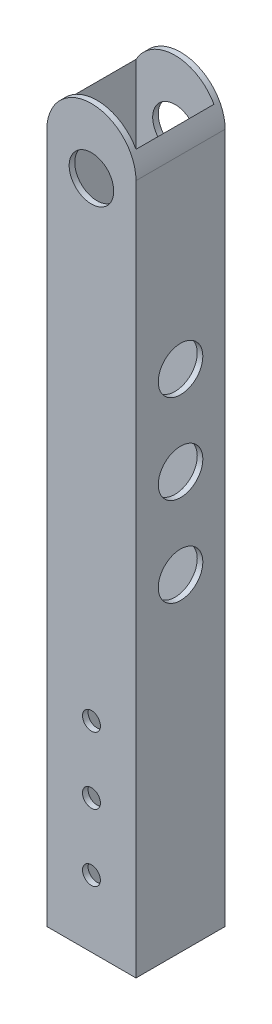
ISO-10303-21;
HEADER;
FILE_DESCRIPTION(('STEP AP214'),'2;1');
FILE_NAME('part.step','',(''),(''),'','','');
FILE_SCHEMA(('AUTOMOTIVE_DESIGN { 1 0 10303 214 1 1 1 1 }'));
ENDSEC;
DATA;
#1=APPLICATION_CONTEXT('core data for automotive mechanical design processes');
#2=APPLICATION_PROTOCOL_DEFINITION('international standard','automotive_design',2000,#1);
#3=PRODUCT_CONTEXT('',#1,'mechanical');
#4=PRODUCT('Part','Part','',(#3));
#5=PRODUCT_RELATED_PRODUCT_CATEGORY('part','',(#4));
#6=PRODUCT_DEFINITION_FORMATION('','',#4);
#7=PRODUCT_DEFINITION_CONTEXT('part definition',#1,'design');
#8=PRODUCT_DEFINITION('design','',#6,#7);
#9=PRODUCT_DEFINITION_SHAPE('','',#8);
#10=(LENGTH_UNIT() NAMED_UNIT(*) SI_UNIT(.MILLI.,.METRE.));
#11=(NAMED_UNIT(*) PLANE_ANGLE_UNIT() SI_UNIT($,.RADIAN.));
#12=(NAMED_UNIT(*) SI_UNIT($,.STERADIAN.) SOLID_ANGLE_UNIT());
#13=UNCERTAINTY_MEASURE_WITH_UNIT(LENGTH_MEASURE(1.E-05),#10,'distance_accuracy_value','');
#14=(GEOMETRIC_REPRESENTATION_CONTEXT(3) GLOBAL_UNCERTAINTY_ASSIGNED_CONTEXT((#13)) GLOBAL_UNIT_ASSIGNED_CONTEXT((#10,
#11,#12)) REPRESENTATION_CONTEXT('',''));
#15=CARTESIAN_POINT('',(0.,0.,0.));
#16=DIRECTION('',(0.,0.,1.));
#17=DIRECTION('',(1.,0.,0.));
#18=AXIS2_PLACEMENT_3D('',#15,#16,#17);
#19=CARTESIAN_POINT('',(0.,86.2965,12.7));
#20=DIRECTION('',(0.,0.,1.));
#21=DIRECTION('',(1.,0.,0.));
#22=AXIS2_PLACEMENT_3D('',#19,#20,#21);
#23=CYLINDRICAL_SURFACE('',#22,6.35);
#24=CARTESIAN_POINT('',(0.,86.2965,-11.1125));
#25=DIRECTION('',(0.,0.,1.));
#26=DIRECTION('',(1.,0.,0.));
#27=AXIS2_PLACEMENT_3D('',#24,#25,#26);
#28=CIRCLE('',#27,6.35);
#29=CARTESIAN_POINT('',(6.35,86.2965,-11.1125));
#30=VERTEX_POINT('',#29);
#31=EDGE_CURVE('E196',#30,#30,#28,.F.);
#32=ORIENTED_EDGE('',*,*,#31,.F.);
#33=EDGE_LOOP('',(#32));
#34=FACE_BOUND('',#33,.T.);
#35=CARTESIAN_POINT('',(0.,86.2965,-12.7));
#36=DIRECTION('',(0.,0.,1.));
#37=DIRECTION('',(1.,0.,0.));
#38=AXIS2_PLACEMENT_3D('',#35,#36,#37);
#39=CIRCLE('',#38,6.35);
#40=CARTESIAN_POINT('',(6.35,86.2965,-12.7));
#41=VERTEX_POINT('',#40);
#42=EDGE_CURVE('E19',#41,#41,#39,.T.);
#43=ORIENTED_EDGE('',*,*,#42,.F.);
#44=EDGE_LOOP('',(#43));
#45=FACE_BOUND('',#44,.T.);
#46=ADVANCED_FACE('F16',(#34,#45),#23,.F.);
#47=CARTESIAN_POINT('',(0.,-47.625,-12.7));
#48=DIRECTION('',(0.,0.,-1.));
#49=DIRECTION('',(-1.,0.,0.));
#50=AXIS2_PLACEMENT_3D('',#47,#48,#49);
#51=CYLINDRICAL_SURFACE('',#50,6.35);
#52=CARTESIAN_POINT('',(0.,-47.625,-11.1125));
#53=DIRECTION('',(0.,0.,-1.));
#54=DIRECTION('',(-1.,0.,0.));
#55=AXIS2_PLACEMENT_3D('',#52,#53,#54);
#56=CIRCLE('',#55,6.35);
#57=CARTESIAN_POINT('',(-6.35,-47.625,-11.1125));
#58=VERTEX_POINT('',#57);
#59=EDGE_CURVE('E193',#58,#58,#56,.T.);
#60=ORIENTED_EDGE('',*,*,#59,.F.);
#61=EDGE_LOOP('',(#60));
#62=FACE_BOUND('',#61,.T.);
#63=CARTESIAN_POINT('',(0.,-47.625,-12.7));
#64=DIRECTION('',(0.,0.,-1.));
#65=DIRECTION('',(-1.,0.,0.));
#66=AXIS2_PLACEMENT_3D('',#63,#64,#65);
#67=CIRCLE('',#66,6.35);
#68=CARTESIAN_POINT('',(-6.35,-47.625,-12.7));
#69=VERTEX_POINT('',#68);
#70=EDGE_CURVE('E213',#69,#69,#67,.F.);
#71=ORIENTED_EDGE('',*,*,#70,.F.);
#72=EDGE_LOOP('',(#71));
#73=FACE_BOUND('',#72,.T.);
#74=ADVANCED_FACE('F223',(#62,#73),#51,.F.);
#75=CARTESIAN_POINT('',(0.,-66.675,-12.7));
#76=DIRECTION('',(0.,0.,-1.));
#77=DIRECTION('',(-1.,0.,0.));
#78=AXIS2_PLACEMENT_3D('',#75,#76,#77);
#79=CYLINDRICAL_SURFACE('',#78,6.35);
#80=CARTESIAN_POINT('',(0.,-66.675,-11.1125));
#81=DIRECTION('',(0.,0.,-1.));
#82=DIRECTION('',(-1.,0.,0.));
#83=AXIS2_PLACEMENT_3D('',#80,#81,#82);
#84=CIRCLE('',#83,6.35);
#85=CARTESIAN_POINT('',(-6.35,-66.675,-11.1125));
#86=VERTEX_POINT('',#85);
#87=EDGE_CURVE('E190',#86,#86,#84,.T.);
#88=ORIENTED_EDGE('',*,*,#87,.F.);
#89=EDGE_LOOP('',(#88));
#90=FACE_BOUND('',#89,.T.);
#91=CARTESIAN_POINT('',(0.,-66.675,-12.7));
#92=DIRECTION('',(0.,0.,-1.));
#93=DIRECTION('',(-1.,0.,0.));
#94=AXIS2_PLACEMENT_3D('',#91,#92,#93);
#95=CIRCLE('',#94,6.35);
#96=CARTESIAN_POINT('',(-6.35,-66.675,-12.7));
#97=VERTEX_POINT('',#96);
#98=EDGE_CURVE('E211',#97,#97,#95,.F.);
#99=ORIENTED_EDGE('',*,*,#98,.F.);
#100=EDGE_LOOP('',(#99));
#101=FACE_BOUND('',#100,.T.);
#102=ADVANCED_FACE('F229',(#90,#101),#79,.F.);
#103=CARTESIAN_POINT('',(0.,-85.725,-12.7));
#104=DIRECTION('',(0.,0.,-1.));
#105=DIRECTION('',(-1.,0.,0.));
#106=AXIS2_PLACEMENT_3D('',#103,#104,#105);
#107=CYLINDRICAL_SURFACE('',#106,6.35);
#108=CARTESIAN_POINT('',(0.,-85.725,-11.1125));
#109=DIRECTION('',(0.,0.,-1.));
#110=DIRECTION('',(-1.,0.,0.));
#111=AXIS2_PLACEMENT_3D('',#108,#109,#110);
#112=CIRCLE('',#111,6.35);
#113=CARTESIAN_POINT('',(-6.35,-85.725,-11.1125));
#114=VERTEX_POINT('',#113);
#115=EDGE_CURVE('E97',#114,#114,#112,.T.);
#116=ORIENTED_EDGE('',*,*,#115,.F.);
#117=EDGE_LOOP('',(#116));
#118=FACE_BOUND('',#117,.T.);
#119=CARTESIAN_POINT('',(0.,-85.725,-12.7));
#120=DIRECTION('',(0.,0.,-1.));
#121=DIRECTION('',(-1.,0.,0.));
#122=AXIS2_PLACEMENT_3D('',#119,#120,#121);
#123=CIRCLE('',#122,6.35);
#124=CARTESIAN_POINT('',(-6.35,-85.725,-12.7));
#125=VERTEX_POINT('',#124);
#126=EDGE_CURVE('E208',#125,#125,#123,.F.);
#127=ORIENTED_EDGE('',*,*,#126,.F.);
#128=EDGE_LOOP('',(#127));
#129=FACE_BOUND('',#128,.T.);
#130=ADVANCED_FACE('F310',(#118,#129),#107,.F.);
#131=CARTESIAN_POINT('',(-12.7,13.8290638387792,4.06024414090264E-13));
#132=DIRECTION('',(-1.,0.,0.));
#133=DIRECTION('',(0.,0.,1.));
#134=AXIS2_PLACEMENT_3D('',#131,#132,#133);
#135=CYLINDRICAL_SURFACE('',#134,2.5527);
#136=CARTESIAN_POINT('',(-11.1125,13.8290638387792,4.06024414090264E-13));
#137=DIRECTION('',(-1.,0.,0.));
#138=DIRECTION('',(0.,0.,1.));
#139=AXIS2_PLACEMENT_3D('',#136,#137,#138);
#140=CIRCLE('',#139,2.5527);
#141=CARTESIAN_POINT('',(-11.1125,13.8290638387792,2.55270000000041));
#142=VERTEX_POINT('',#141);
#143=EDGE_CURVE('E205',#142,#142,#140,.T.);
#144=ORIENTED_EDGE('',*,*,#143,.F.);
#145=EDGE_LOOP('',(#144));
#146=FACE_BOUND('',#145,.T.);
#147=CARTESIAN_POINT('',(-12.7,13.8290638387792,4.06024414090264E-13));
#148=DIRECTION('',(-1.,0.,0.));
#149=DIRECTION('',(0.,0.,1.));
#150=AXIS2_PLACEMENT_3D('',#147,#148,#149);
#151=CIRCLE('',#150,2.5527);
#152=CARTESIAN_POINT('',(-12.7,13.8290638387792,2.55270000000041));
#153=VERTEX_POINT('',#152);
#154=EDGE_CURVE('E175',#153,#153,#151,.F.);
#155=ORIENTED_EDGE('',*,*,#154,.F.);
#156=EDGE_LOOP('',(#155));
#157=FACE_BOUND('',#156,.T.);
#158=ADVANCED_FACE('F306',(#146,#157),#135,.F.);
#159=CARTESIAN_POINT('',(-12.7,-11.5709361612208,4.06024414090264E-13));
#160=DIRECTION('',(-1.,0.,0.));
#161=DIRECTION('',(0.,0.,1.));
#162=AXIS2_PLACEMENT_3D('',#159,#160,#161);
#163=CYLINDRICAL_SURFACE('',#162,2.5527);
#164=CARTESIAN_POINT('',(-11.1125,-11.5709361612208,4.06024414090264E-13));
#165=DIRECTION('',(-1.,0.,0.));
#166=DIRECTION('',(0.,0.,1.));
#167=AXIS2_PLACEMENT_3D('',#164,#165,#166);
#168=CIRCLE('',#167,2.5527);
#169=CARTESIAN_POINT('',(-11.1125,-11.5709361612208,2.55270000000041));
#170=VERTEX_POINT('',#169);
#171=EDGE_CURVE('E202',#170,#170,#168,.T.);
#172=ORIENTED_EDGE('',*,*,#171,.F.);
#173=EDGE_LOOP('',(#172));
#174=FACE_BOUND('',#173,.T.);
#175=CARTESIAN_POINT('',(-12.7,-11.5709361612208,4.06024414090264E-13));
#176=DIRECTION('',(-1.,0.,0.));
#177=DIRECTION('',(0.,0.,1.));
#178=AXIS2_PLACEMENT_3D('',#175,#176,#177);
#179=CIRCLE('',#178,2.5527);
#180=CARTESIAN_POINT('',(-12.7,-11.5709361612208,2.55270000000041));
#181=VERTEX_POINT('',#180);
#182=EDGE_CURVE('E172',#181,#181,#179,.F.);
#183=ORIENTED_EDGE('',*,*,#182,.F.);
#184=EDGE_LOOP('',(#183));
#185=FACE_BOUND('',#184,.T.);
#186=ADVANCED_FACE('F302',(#174,#185),#163,.F.);
#187=CARTESIAN_POINT('',(-12.7,39.229063838769,4.06024414090264E-13));
#188=DIRECTION('',(-1.,0.,0.));
#189=DIRECTION('',(0.,0.,1.));
#190=AXIS2_PLACEMENT_3D('',#187,#188,#189);
#191=CYLINDRICAL_SURFACE('',#190,2.5527);
#192=CARTESIAN_POINT('',(-11.1125,39.229063838769,4.06024414090264E-13));
#193=DIRECTION('',(-1.,0.,0.));
#194=DIRECTION('',(0.,0.,1.));
#195=AXIS2_PLACEMENT_3D('',#192,#193,#194);
#196=CIRCLE('',#195,2.5527);
#197=CARTESIAN_POINT('',(-11.1125,39.229063838769,2.55270000000041));
#198=VERTEX_POINT('',#197);
#199=EDGE_CURVE('E199',#198,#198,#196,.T.);
#200=ORIENTED_EDGE('',*,*,#199,.F.);
#201=EDGE_LOOP('',(#200));
#202=FACE_BOUND('',#201,.T.);
#203=CARTESIAN_POINT('',(-12.7,39.229063838769,4.06024414090264E-13));
#204=DIRECTION('',(-1.,0.,0.));
#205=DIRECTION('',(0.,0.,1.));
#206=AXIS2_PLACEMENT_3D('',#203,#204,#205);
#207=CIRCLE('',#206,2.5527);
#208=CARTESIAN_POINT('',(-12.7,39.229063838769,2.55270000000041));
#209=VERTEX_POINT('',#208);
#210=EDGE_CURVE('E169',#209,#209,#207,.F.);
#211=ORIENTED_EDGE('',*,*,#210,.F.);
#212=EDGE_LOOP('',(#211));
#213=FACE_BOUND('',#212,.T.);
#214=ADVANCED_FACE('F298',(#202,#213),#191,.F.);
#215=CARTESIAN_POINT('',(12.7,13.8290638387792,4.0320444760778E-13));
#216=DIRECTION('',(1.,0.,0.));
#217=DIRECTION('',(0.,0.,-1.));
#218=AXIS2_PLACEMENT_3D('',#215,#216,#217);
#219=CYLINDRICAL_SURFACE('',#218,6.35);
#220=CARTESIAN_POINT('',(11.1125,13.8290638387792,4.0320444760778E-13));
#221=DIRECTION('',(1.,0.,0.));
#222=DIRECTION('',(0.,0.,-1.));
#223=AXIS2_PLACEMENT_3D('',#220,#221,#222);
#224=CIRCLE('',#223,6.35);
#225=CARTESIAN_POINT('',(11.1125,13.8290638387792,-6.3499999999996));
#226=VERTEX_POINT('',#225);
#227=EDGE_CURVE('E96',#226,#226,#224,.T.);
#228=ORIENTED_EDGE('',*,*,#227,.F.);
#229=EDGE_LOOP('',(#228));
#230=FACE_BOUND('',#229,.T.);
#231=CARTESIAN_POINT('',(12.7,13.8290638387792,4.0320444760778E-13));
#232=DIRECTION('',(1.,0.,0.));
#233=DIRECTION('',(0.,0.,-1.));
#234=AXIS2_PLACEMENT_3D('',#231,#232,#233);
#235=CIRCLE('',#234,6.35);
#236=CARTESIAN_POINT('',(12.7,13.8290638387792,-6.3499999999996));
#237=VERTEX_POINT('',#236);
#238=EDGE_CURVE('E165',#237,#237,#235,.F.);
#239=ORIENTED_EDGE('',*,*,#238,.F.);
#240=EDGE_LOOP('',(#239));
#241=FACE_BOUND('',#240,.T.);
#242=ADVANCED_FACE('F294',(#230,#241),#219,.F.);
#243=CARTESIAN_POINT('',(12.7,-11.5709361612208,4.0320444760778E-13));
#244=DIRECTION('',(1.,0.,0.));
#245=DIRECTION('',(0.,0.,-1.));
#246=AXIS2_PLACEMENT_3D('',#243,#244,#245);
#247=CYLINDRICAL_SURFACE('',#246,6.35);
#248=CARTESIAN_POINT('',(11.1125,-11.5709361612208,4.0320444760778E-13));
#249=DIRECTION('',(1.,0.,0.));
#250=DIRECTION('',(0.,0.,-1.));
#251=AXIS2_PLACEMENT_3D('',#248,#249,#250);
#252=CIRCLE('',#251,6.35);
#253=CARTESIAN_POINT('',(11.1125,-11.5709361612208,-6.3499999999996));
#254=VERTEX_POINT('',#253);
#255=EDGE_CURVE('E183',#254,#254,#252,.T.);
#256=ORIENTED_EDGE('',*,*,#255,.F.);
#257=EDGE_LOOP('',(#256));
#258=FACE_BOUND('',#257,.T.);
#259=CARTESIAN_POINT('',(12.7,-11.5709361612208,4.0320444760778E-13));
#260=DIRECTION('',(1.,0.,0.));
#261=DIRECTION('',(0.,0.,-1.));
#262=AXIS2_PLACEMENT_3D('',#259,#260,#261);
#263=CIRCLE('',#262,6.35);
#264=CARTESIAN_POINT('',(12.7,-11.5709361612208,-6.3499999999996));
#265=VERTEX_POINT('',#264);
#266=EDGE_CURVE('E162',#265,#265,#263,.F.);
#267=ORIENTED_EDGE('',*,*,#266,.F.);
#268=EDGE_LOOP('',(#267));
#269=FACE_BOUND('',#268,.T.);
#270=ADVANCED_FACE('F290',(#258,#269),#247,.F.);
#271=CARTESIAN_POINT('',(12.7,39.229063838769,4.0320444760778E-13));
#272=DIRECTION('',(1.,0.,0.));
#273=DIRECTION('',(0.,0.,-1.));
#274=AXIS2_PLACEMENT_3D('',#271,#272,#273);
#275=CYLINDRICAL_SURFACE('',#274,6.35);
#276=CARTESIAN_POINT('',(11.1125,39.229063838769,4.0320444760778E-13));
#277=DIRECTION('',(1.,0.,0.));
#278=DIRECTION('',(0.,0.,-1.));
#279=AXIS2_PLACEMENT_3D('',#276,#277,#278);
#280=CIRCLE('',#279,6.35);
#281=CARTESIAN_POINT('',(11.1125,39.229063838769,-6.3499999999996));
#282=VERTEX_POINT('',#281);
#283=EDGE_CURVE('E179',#282,#282,#280,.T.);
#284=ORIENTED_EDGE('',*,*,#283,.F.);
#285=EDGE_LOOP('',(#284));
#286=FACE_BOUND('',#285,.T.);
#287=CARTESIAN_POINT('',(12.7,39.229063838769,4.0320444760778E-13));
#288=DIRECTION('',(1.,0.,0.));
#289=DIRECTION('',(0.,0.,-1.));
#290=AXIS2_PLACEMENT_3D('',#287,#288,#289);
#291=CIRCLE('',#290,6.35);
#292=CARTESIAN_POINT('',(12.7,39.229063838769,-6.3499999999996));
#293=VERTEX_POINT('',#292);
#294=EDGE_CURVE('E159',#293,#293,#291,.F.);
#295=ORIENTED_EDGE('',*,*,#294,.F.);
#296=EDGE_LOOP('',(#295));
#297=FACE_BOUND('',#296,.T.);
#298=ADVANCED_FACE('F286',(#286,#297),#275,.F.);
#299=CARTESIAN_POINT('',(12.7,-104.775,-12.7));
#300=DIRECTION('',(0.,0.,-1.));
#301=DIRECTION('',(-1.,0.,0.));
#302=AXIS2_PLACEMENT_3D('',#299,#300,#301);
#303=PLANE('',#302);
#304=ORIENTED_EDGE('',*,*,#126,.T.);
#305=EDGE_LOOP('',(#304));
#306=FACE_BOUND('',#305,.T.);
#307=ORIENTED_EDGE('',*,*,#98,.T.);
#308=EDGE_LOOP('',(#307));
#309=FACE_BOUND('',#308,.T.);
#310=ORIENTED_EDGE('',*,*,#70,.T.);
#311=EDGE_LOOP('',(#310));
#312=FACE_BOUND('',#311,.T.);
#313=ORIENTED_EDGE('',*,*,#42,.T.);
#314=EDGE_LOOP('',(#313));
#315=FACE_BOUND('',#314,.T.);
#316=DIRECTION('',(0.,1.,0.));
#317=VECTOR('',#316,1.);
#318=CARTESIAN_POINT('',(-12.7,-104.775,-12.7));
#319=LINE('',#318,#317);
#320=CARTESIAN_POINT('',(-12.7,92.075,-12.7));
#321=VERTEX_POINT('',#320);
#322=CARTESIAN_POINT('',(-12.7,-104.775,-12.7));
#323=VERTEX_POINT('',#322);
#324=EDGE_CURVE('E178',#321,#323,#319,.F.);
#325=ORIENTED_EDGE('',*,*,#324,.F.);
#326=CARTESIAN_POINT('',(0.,92.075,-12.7));
#327=DIRECTION('',(0.,0.,1.));
#328=DIRECTION('',(1.,0.,0.));
#329=AXIS2_PLACEMENT_3D('',#326,#327,#328);
#330=CIRCLE('',#329,12.7);
#331=CARTESIAN_POINT('',(12.7,92.075,-12.7));
#332=VERTEX_POINT('',#331);
#333=EDGE_CURVE('E64',#332,#321,#330,.T.);
#334=ORIENTED_EDGE('',*,*,#333,.F.);
#335=DIRECTION('',(0.,1.,0.));
#336=VECTOR('',#335,1.);
#337=CARTESIAN_POINT('',(12.7,-104.775,-12.7));
#338=LINE('',#337,#336);
#339=CARTESIAN_POINT('',(12.7,-104.775,-12.7));
#340=VERTEX_POINT('',#339);
#341=EDGE_CURVE('E168',#340,#332,#338,.T.);
#342=ORIENTED_EDGE('',*,*,#341,.F.);
#343=DIRECTION('',(1.,0.,0.));
#344=VECTOR('',#343,1.);
#345=CARTESIAN_POINT('',(0.,-104.775,-12.7));
#346=LINE('',#345,#344);
#347=EDGE_CURVE('E70',#340,#323,#346,.F.);
#348=ORIENTED_EDGE('',*,*,#347,.T.);
#349=EDGE_LOOP('',(#325,#334,#342,#348));
#350=FACE_BOUND('',#349,.T.);
#351=ADVANCED_FACE('F220',(#306,#309,#312,#315,#350),#303,.T.);
#352=CARTESIAN_POINT('',(-11.1125,-104.775,11.1125));
#353=DIRECTION('',(1.,0.,0.));
#354=DIRECTION('',(0.,0.,-1.));
#355=AXIS2_PLACEMENT_3D('',#352,#353,#354);
#356=PLANE('',#355);
#357=ORIENTED_EDGE('',*,*,#199,.T.);
#358=EDGE_LOOP('',(#357));
#359=FACE_BOUND('',#358,.T.);
#360=ORIENTED_EDGE('',*,*,#171,.T.);
#361=EDGE_LOOP('',(#360));
#362=FACE_BOUND('',#361,.T.);
#363=ORIENTED_EDGE('',*,*,#143,.T.);
#364=EDGE_LOOP('',(#363));
#365=FACE_BOUND('',#364,.T.);
#366=DIRECTION('',(0.,1.,0.));
#367=VECTOR('',#366,1.);
#368=CARTESIAN_POINT('',(-11.1125,-104.775,-11.1125));
#369=LINE('',#368,#367);
#370=CARTESIAN_POINT('',(-11.1124999999998,98.2233610621046,-11.1125));
#371=VERTEX_POINT('',#370);
#372=CARTESIAN_POINT('',(-11.1125,-104.775,-11.1125));
#373=VERTEX_POINT('',#372);
#374=EDGE_CURVE('E103',#371,#373,#369,.F.);
#375=ORIENTED_EDGE('',*,*,#374,.F.);
#376=DIRECTION('',(0.,0.,1.));
#377=VECTOR('',#376,1.);
#378=CARTESIAN_POINT('',(-11.1124999999996,98.223361062105,-45.81144));
#379=LINE('',#378,#377);
#380=CARTESIAN_POINT('',(-11.1124999999998,98.2233610621046,11.1125));
#381=VERTEX_POINT('',#380);
#382=EDGE_CURVE('E156',#381,#371,#379,.F.);
#383=ORIENTED_EDGE('',*,*,#382,.F.);
#384=DIRECTION('',(0.,1.,0.));
#385=VECTOR('',#384,1.);
#386=CARTESIAN_POINT('',(-11.1125,-104.775,11.1125));
#387=LINE('',#386,#385);
#388=CARTESIAN_POINT('',(-11.1125,-104.775,11.1125));
#389=VERTEX_POINT('',#388);
#390=EDGE_CURVE('E509',#389,#381,#387,.T.);
#391=ORIENTED_EDGE('',*,*,#390,.F.);
#392=DIRECTION('',(0.,0.,1.));
#393=VECTOR('',#392,1.);
#394=CARTESIAN_POINT('',(-11.1125,-104.775,0.));
#395=LINE('',#394,#393);
#396=EDGE_CURVE('E107',#389,#373,#395,.F.);
#397=ORIENTED_EDGE('',*,*,#396,.T.);
#398=EDGE_LOOP('',(#375,#383,#391,#397));
#399=FACE_BOUND('',#398,.T.);
#400=ADVANCED_FACE('F279',(#359,#362,#365,#399),#356,.T.);
#401=CARTESIAN_POINT('',(-11.1125,-104.775,-11.1125));
#402=DIRECTION('',(0.,0.,1.));
#403=DIRECTION('',(1.,0.,0.));
#404=AXIS2_PLACEMENT_3D('',#401,#402,#403);
#405=PLANE('',#404);
#406=ORIENTED_EDGE('',*,*,#115,.T.);
#407=EDGE_LOOP('',(#406));
#408=FACE_BOUND('',#407,.T.);
#409=ORIENTED_EDGE('',*,*,#87,.T.);
#410=EDGE_LOOP('',(#409));
#411=FACE_BOUND('',#410,.T.);
#412=ORIENTED_EDGE('',*,*,#59,.T.);
#413=EDGE_LOOP('',(#412));
#414=FACE_BOUND('',#413,.T.);
#415=ORIENTED_EDGE('',*,*,#31,.T.);
#416=EDGE_LOOP('',(#415));
#417=FACE_BOUND('',#416,.T.);
#418=DIRECTION('',(0.,1.,0.));
#419=VECTOR('',#418,1.);
#420=CARTESIAN_POINT('',(11.1125,-104.775,-11.1125));
#421=LINE('',#420,#419);
#422=CARTESIAN_POINT('',(11.1124999999998,98.2233610621046,-11.1125));
#423=VERTEX_POINT('',#422);
#424=CARTESIAN_POINT('',(11.1125,-104.775,-11.1125));
#425=VERTEX_POINT('',#424);
#426=EDGE_CURVE('E85',#423,#425,#421,.F.);
#427=ORIENTED_EDGE('',*,*,#426,.F.);
#428=CARTESIAN_POINT('',(0.,92.075,-11.1125));
#429=DIRECTION('',(0.,0.,1.));
#430=DIRECTION('',(1.,0.,0.));
#431=AXIS2_PLACEMENT_3D('',#428,#429,#430);
#432=CIRCLE('',#431,12.7);
#433=EDGE_CURVE('E154',#371,#423,#432,.F.);
#434=ORIENTED_EDGE('',*,*,#433,.F.);
#435=ORIENTED_EDGE('',*,*,#374,.T.);
#436=DIRECTION('',(1.,0.,0.));
#437=VECTOR('',#436,1.);
#438=CARTESIAN_POINT('',(0.,-104.775,-11.1125));
#439=LINE('',#438,#437);
#440=EDGE_CURVE('E101',#373,#425,#439,.T.);
#441=ORIENTED_EDGE('',*,*,#440,.T.);
#442=EDGE_LOOP('',(#427,#434,#435,#441));
#443=FACE_BOUND('',#442,.T.);
#444=ADVANCED_FACE('F102',(#408,#411,#414,#417,#443),#405,.T.);
#445=CARTESIAN_POINT('',(11.1125,-104.775,-11.1125));
#446=DIRECTION('',(-1.,0.,0.));
#447=DIRECTION('',(0.,0.,1.));
#448=AXIS2_PLACEMENT_3D('',#445,#446,#447);
#449=PLANE('',#448);
#450=ORIENTED_EDGE('',*,*,#283,.T.);
#451=EDGE_LOOP('',(#450));
#452=FACE_BOUND('',#451,.T.);
#453=ORIENTED_EDGE('',*,*,#255,.T.);
#454=EDGE_LOOP('',(#453));
#455=FACE_BOUND('',#454,.T.);
#456=ORIENTED_EDGE('',*,*,#227,.T.);
#457=EDGE_LOOP('',(#456));
#458=FACE_BOUND('',#457,.T.);
#459=DIRECTION('',(0.,1.,0.));
#460=VECTOR('',#459,1.);
#461=CARTESIAN_POINT('',(11.1125,-104.775,11.1125));
#462=LINE('',#461,#460);
#463=CARTESIAN_POINT('',(11.1124999999998,98.2233610621046,11.1125));
#464=VERTEX_POINT('',#463);
#465=CARTESIAN_POINT('',(11.1125,-104.775,11.1125));
#466=VERTEX_POINT('',#465);
#467=EDGE_CURVE('E182',#464,#466,#462,.F.);
#468=ORIENTED_EDGE('',*,*,#467,.F.);
#469=DIRECTION('',(0.,0.,1.));
#470=VECTOR('',#469,1.);
#471=CARTESIAN_POINT('',(11.1124999999996,98.223361062105,-45.81144));
#472=LINE('',#471,#470);
#473=EDGE_CURVE('E92',#423,#464,#472,.T.);
#474=ORIENTED_EDGE('',*,*,#473,.F.);
#475=ORIENTED_EDGE('',*,*,#426,.T.);
#476=DIRECTION('',(0.,0.,1.));
#477=VECTOR('',#476,1.);
#478=CARTESIAN_POINT('',(11.1125,-104.775,0.));
#479=LINE('',#478,#477);
#480=EDGE_CURVE('E89',#425,#466,#479,.T.);
#481=ORIENTED_EDGE('',*,*,#480,.T.);
#482=EDGE_LOOP('',(#468,#474,#475,#481));
#483=FACE_BOUND('',#482,.T.);
#484=ADVANCED_FACE('F87',(#452,#455,#458,#483),#449,.T.);
#485=CARTESIAN_POINT('',(11.1125,-104.775,11.1125));
#486=DIRECTION('',(0.,0.,-1.));
#487=DIRECTION('',(-1.,0.,0.));
#488=AXIS2_PLACEMENT_3D('',#485,#486,#487);
#489=PLANE('',#488);
#490=CARTESIAN_POINT('',(0.,-47.625,11.1125));
#491=DIRECTION('',(0.,0.,-1.));
#492=DIRECTION('',(-1.,0.,0.));
#493=AXIS2_PLACEMENT_3D('',#490,#491,#492);
#494=CIRCLE('',#493,2.5527);
#495=CARTESIAN_POINT('',(-2.5527,-47.625,11.1125));
#496=VERTEX_POINT('',#495);
#497=EDGE_CURVE('E138',#496,#496,#494,.F.);
#498=ORIENTED_EDGE('',*,*,#497,.T.);
#499=EDGE_LOOP('',(#498));
#500=FACE_BOUND('',#499,.T.);
#501=CARTESIAN_POINT('',(0.,-66.675,11.1125));
#502=DIRECTION('',(0.,0.,-1.));
#503=DIRECTION('',(-1.,0.,0.));
#504=AXIS2_PLACEMENT_3D('',#501,#502,#503);
#505=CIRCLE('',#504,2.5527);
#506=CARTESIAN_POINT('',(-2.5527,-66.675,11.1125));
#507=VERTEX_POINT('',#506);
#508=EDGE_CURVE('E142',#507,#507,#505,.F.);
#509=ORIENTED_EDGE('',*,*,#508,.T.);
#510=EDGE_LOOP('',(#509));
#511=FACE_BOUND('',#510,.T.);
#512=CARTESIAN_POINT('',(0.,-85.725,11.1125));
#513=DIRECTION('',(0.,0.,-1.));
#514=DIRECTION('',(-1.,0.,0.));
#515=AXIS2_PLACEMENT_3D('',#512,#513,#514);
#516=CIRCLE('',#515,2.5527);
#517=CARTESIAN_POINT('',(-2.5527,-85.725,11.1125));
#518=VERTEX_POINT('',#517);
#519=EDGE_CURVE('E145',#518,#518,#516,.F.);
#520=ORIENTED_EDGE('',*,*,#519,.T.);
#521=EDGE_LOOP('',(#520));
#522=FACE_BOUND('',#521,.T.);
#523=CARTESIAN_POINT('',(0.,86.2965,11.1125));
#524=DIRECTION('',(0.,0.,1.));
#525=DIRECTION('',(1.,0.,0.));
#526=AXIS2_PLACEMENT_3D('',#523,#524,#525);
#527=CIRCLE('',#526,6.35);
#528=CARTESIAN_POINT('',(6.35,86.2965,11.1125));
#529=VERTEX_POINT('',#528);
#530=EDGE_CURVE('E148',#529,#529,#527,.T.);
#531=ORIENTED_EDGE('',*,*,#530,.T.);
#532=EDGE_LOOP('',(#531));
#533=FACE_BOUND('',#532,.T.);
#534=ORIENTED_EDGE('',*,*,#390,.T.);
#535=CARTESIAN_POINT('',(0.,92.075,11.1125));
#536=DIRECTION('',(0.,0.,1.));
#537=DIRECTION('',(1.,0.,0.));
#538=AXIS2_PLACEMENT_3D('',#535,#536,#537);
#539=CIRCLE('',#538,12.7);
#540=EDGE_CURVE('E151',#464,#381,#539,.T.);
#541=ORIENTED_EDGE('',*,*,#540,.F.);
#542=ORIENTED_EDGE('',*,*,#467,.T.);
#543=DIRECTION('',(1.,0.,0.));
#544=VECTOR('',#543,1.);
#545=CARTESIAN_POINT('',(0.,-104.775,11.1125));
#546=LINE('',#545,#544);
#547=EDGE_CURVE('E112',#466,#389,#546,.F.);
#548=ORIENTED_EDGE('',*,*,#547,.T.);
#549=EDGE_LOOP('',(#534,#541,#542,#548));
#550=FACE_BOUND('',#549,.T.);
#551=ADVANCED_FACE('F269',(#500,#511,#522,#533,#550),#489,.T.);
#552=CARTESIAN_POINT('',(-12.7,-104.775,-12.7));
#553=DIRECTION('',(-1.,0.,0.));
#554=DIRECTION('',(0.,0.,1.));
#555=AXIS2_PLACEMENT_3D('',#552,#553,#554);
#556=PLANE('',#555);
#557=ORIENTED_EDGE('',*,*,#210,.T.);
#558=EDGE_LOOP('',(#557));
#559=FACE_BOUND('',#558,.T.);
#560=ORIENTED_EDGE('',*,*,#182,.T.);
#561=EDGE_LOOP('',(#560));
#562=FACE_BOUND('',#561,.T.);
#563=ORIENTED_EDGE('',*,*,#154,.T.);
#564=EDGE_LOOP('',(#563));
#565=FACE_BOUND('',#564,.T.);
#566=DIRECTION('',(0.,1.,0.));
#567=VECTOR('',#566,1.);
#568=CARTESIAN_POINT('',(-12.7,-104.775,12.7));
#569=LINE('',#568,#567);
#570=CARTESIAN_POINT('',(-12.7,92.075,12.7));
#571=VERTEX_POINT('',#570);
#572=CARTESIAN_POINT('',(-12.7,-104.775,12.7));
#573=VERTEX_POINT('',#572);
#574=EDGE_CURVE('E141',#571,#573,#569,.F.);
#575=ORIENTED_EDGE('',*,*,#574,.F.);
#576=DIRECTION('',(0.,0.,1.));
#577=VECTOR('',#576,1.);
#578=CARTESIAN_POINT('',(-12.7,92.075,-45.81144));
#579=LINE('',#578,#577);
#580=EDGE_CURVE('E158',#321,#571,#579,.T.);
#581=ORIENTED_EDGE('',*,*,#580,.F.);
#582=ORIENTED_EDGE('',*,*,#324,.T.);
#583=DIRECTION('',(0.,0.,1.));
#584=VECTOR('',#583,1.);
#585=CARTESIAN_POINT('',(-12.7,-104.775,0.));
#586=LINE('',#585,#584);
#587=EDGE_CURVE('E113',#323,#573,#586,.T.);
#588=ORIENTED_EDGE('',*,*,#587,.T.);
#589=EDGE_LOOP('',(#575,#581,#582,#588));
#590=FACE_BOUND('',#589,.T.);
#591=ADVANCED_FACE('F266',(#559,#562,#565,#590),#556,.T.);
#592=CARTESIAN_POINT('',(0.,-104.775,0.));
#593=DIRECTION('',(0.,1.,0.));
#594=DIRECTION('',(0.,0.,1.));
#595=AXIS2_PLACEMENT_3D('',#592,#593,#594);
#596=PLANE('',#595);
#597=ORIENTED_EDGE('',*,*,#396,.F.);
#598=ORIENTED_EDGE('',*,*,#547,.F.);
#599=ORIENTED_EDGE('',*,*,#480,.F.);
#600=ORIENTED_EDGE('',*,*,#440,.F.);
#601=EDGE_LOOP('',(#597,#598,#599,#600));
#602=FACE_BOUND('',#601,.T.);
#603=ORIENTED_EDGE('',*,*,#587,.F.);
#604=ORIENTED_EDGE('',*,*,#347,.F.);
#605=DIRECTION('',(0.,0.,-1.));
#606=VECTOR('',#605,1.);
#607=CARTESIAN_POINT('',(12.7,-104.775,12.7));
#608=LINE('',#607,#606);
#609=CARTESIAN_POINT('',(12.7,-104.775,12.7));
#610=VERTEX_POINT('',#609);
#611=EDGE_CURVE('E106',#610,#340,#608,.T.);
#612=ORIENTED_EDGE('',*,*,#611,.F.);
#613=DIRECTION('',(1.,0.,0.));
#614=VECTOR('',#613,1.);
#615=CARTESIAN_POINT('',(-12.7,-104.775,12.7));
#616=LINE('',#615,#614);
#617=EDGE_CURVE('E488',#573,#610,#616,.T.);
#618=ORIENTED_EDGE('',*,*,#617,.F.);
#619=EDGE_LOOP('',(#603,#604,#612,#618));
#620=FACE_BOUND('',#619,.T.);
#621=ADVANCED_FACE('F110',(#602,#620),#596,.F.);
#622=CARTESIAN_POINT('',(12.7,-104.775,12.7));
#623=DIRECTION('',(1.,0.,0.));
#624=DIRECTION('',(0.,0.,-1.));
#625=AXIS2_PLACEMENT_3D('',#622,#623,#624);
#626=PLANE('',#625);
#627=ORIENTED_EDGE('',*,*,#294,.T.);
#628=EDGE_LOOP('',(#627));
#629=FACE_BOUND('',#628,.T.);
#630=ORIENTED_EDGE('',*,*,#266,.T.);
#631=EDGE_LOOP('',(#630));
#632=FACE_BOUND('',#631,.T.);
#633=ORIENTED_EDGE('',*,*,#238,.T.);
#634=EDGE_LOOP('',(#633));
#635=FACE_BOUND('',#634,.T.);
#636=ORIENTED_EDGE('',*,*,#341,.T.);
#637=DIRECTION('',(0.,0.,1.));
#638=VECTOR('',#637,1.);
#639=CARTESIAN_POINT('',(12.7,92.075,-45.81144));
#640=LINE('',#639,#638);
#641=CARTESIAN_POINT('',(12.7,92.075,12.7));
#642=VERTEX_POINT('',#641);
#643=EDGE_CURVE('E34',#642,#332,#640,.F.);
#644=ORIENTED_EDGE('',*,*,#643,.F.);
#645=DIRECTION('',(0.,1.,0.));
#646=VECTOR('',#645,1.);
#647=CARTESIAN_POINT('',(12.7,-104.775,12.7));
#648=LINE('',#647,#646);
#649=EDGE_CURVE('E137',#610,#642,#648,.T.);
#650=ORIENTED_EDGE('',*,*,#649,.F.);
#651=ORIENTED_EDGE('',*,*,#611,.T.);
#652=EDGE_LOOP('',(#636,#644,#650,#651));
#653=FACE_BOUND('',#652,.T.);
#654=ADVANCED_FACE('F259',(#629,#632,#635,#653),#626,.T.);
#655=CARTESIAN_POINT('',(0.,92.075,-45.81144));
#656=DIRECTION('',(0.,0.,1.));
#657=DIRECTION('',(1.,0.,0.));
#658=AXIS2_PLACEMENT_3D('',#655,#656,#657);
#659=CYLINDRICAL_SURFACE('',#658,12.7);
#660=ORIENTED_EDGE('',*,*,#473,.T.);
#661=ORIENTED_EDGE('',*,*,#540,.T.);
#662=ORIENTED_EDGE('',*,*,#382,.T.);
#663=ORIENTED_EDGE('',*,*,#433,.T.);
#664=EDGE_LOOP('',(#660,#661,#662,#663));
#665=FACE_BOUND('',#664,.T.);
#666=CARTESIAN_POINT('',(0.,92.075,12.7));
#667=DIRECTION('',(0.,0.,1.));
#668=DIRECTION('',(1.,0.,0.));
#669=AXIS2_PLACEMENT_3D('',#666,#667,#668);
#670=CIRCLE('',#669,12.7);
#671=EDGE_CURVE('E134',#642,#571,#670,.T.);
#672=ORIENTED_EDGE('',*,*,#671,.F.);
#673=ORIENTED_EDGE('',*,*,#643,.T.);
#674=ORIENTED_EDGE('',*,*,#333,.T.);
#675=ORIENTED_EDGE('',*,*,#580,.T.);
#676=EDGE_LOOP('',(#672,#673,#674,#675));
#677=FACE_BOUND('',#676,.T.);
#678=ADVANCED_FACE('F255',(#665,#677),#659,.T.);
#679=CARTESIAN_POINT('',(0.,86.2965,12.7));
#680=DIRECTION('',(0.,0.,1.));
#681=DIRECTION('',(1.,0.,0.));
#682=AXIS2_PLACEMENT_3D('',#679,#680,#681);
#683=CYLINDRICAL_SURFACE('',#682,6.35);
#684=ORIENTED_EDGE('',*,*,#530,.F.);
#685=EDGE_LOOP('',(#684));
#686=FACE_BOUND('',#685,.T.);
#687=CARTESIAN_POINT('',(0.,86.2965,12.7));
#688=DIRECTION('',(0.,0.,1.));
#689=DIRECTION('',(1.,0.,0.));
#690=AXIS2_PLACEMENT_3D('',#687,#688,#689);
#691=CIRCLE('',#690,6.35);
#692=CARTESIAN_POINT('',(6.35,86.2965,12.7));
#693=VERTEX_POINT('',#692);
#694=EDGE_CURVE('E131',#693,#693,#691,.F.);
#695=ORIENTED_EDGE('',*,*,#694,.F.);
#696=EDGE_LOOP('',(#695));
#697=FACE_BOUND('',#696,.T.);
#698=ADVANCED_FACE('F251',(#686,#697),#683,.F.);
#699=CARTESIAN_POINT('',(0.,-85.725,-12.7));
#700=DIRECTION('',(0.,0.,-1.));
#701=DIRECTION('',(-1.,0.,0.));
#702=AXIS2_PLACEMENT_3D('',#699,#700,#701);
#703=CYLINDRICAL_SURFACE('',#702,2.5527);
#704=ORIENTED_EDGE('',*,*,#519,.F.);
#705=EDGE_LOOP('',(#704));
#706=FACE_BOUND('',#705,.T.);
#707=CARTESIAN_POINT('',(0.,-85.725,12.7));
#708=DIRECTION('',(0.,0.,-1.));
#709=DIRECTION('',(-1.,0.,0.));
#710=AXIS2_PLACEMENT_3D('',#707,#708,#709);
#711=CIRCLE('',#710,2.5527);
#712=CARTESIAN_POINT('',(-2.5527,-85.725,12.7));
#713=VERTEX_POINT('',#712);
#714=EDGE_CURVE('E128',#713,#713,#711,.T.);
#715=ORIENTED_EDGE('',*,*,#714,.F.);
#716=EDGE_LOOP('',(#715));
#717=FACE_BOUND('',#716,.T.);
#718=ADVANCED_FACE('F247',(#706,#717),#703,.F.);
#719=CARTESIAN_POINT('',(0.,-66.675,-12.7));
#720=DIRECTION('',(0.,0.,-1.));
#721=DIRECTION('',(-1.,0.,0.));
#722=AXIS2_PLACEMENT_3D('',#719,#720,#721);
#723=CYLINDRICAL_SURFACE('',#722,2.5527);
#724=ORIENTED_EDGE('',*,*,#508,.F.);
#725=EDGE_LOOP('',(#724));
#726=FACE_BOUND('',#725,.T.);
#727=CARTESIAN_POINT('',(0.,-66.675,12.7));
#728=DIRECTION('',(0.,0.,-1.));
#729=DIRECTION('',(-1.,0.,0.));
#730=AXIS2_PLACEMENT_3D('',#727,#728,#729);
#731=CIRCLE('',#730,2.5527);
#732=CARTESIAN_POINT('',(-2.5527,-66.675,12.7));
#733=VERTEX_POINT('',#732);
#734=EDGE_CURVE('E25',#733,#733,#731,.T.);
#735=ORIENTED_EDGE('',*,*,#734,.F.);
#736=EDGE_LOOP('',(#735));
#737=FACE_BOUND('',#736,.T.);
#738=ADVANCED_FACE('F240',(#726,#737),#723,.F.);
#739=CARTESIAN_POINT('',(0.,-47.625,-12.7));
#740=DIRECTION('',(0.,0.,-1.));
#741=DIRECTION('',(-1.,0.,0.));
#742=AXIS2_PLACEMENT_3D('',#739,#740,#741);
#743=CYLINDRICAL_SURFACE('',#742,2.5527);
#744=ORIENTED_EDGE('',*,*,#497,.F.);
#745=EDGE_LOOP('',(#744));
#746=FACE_BOUND('',#745,.T.);
#747=CARTESIAN_POINT('',(0.,-47.625,12.7));
#748=DIRECTION('',(0.,0.,-1.));
#749=DIRECTION('',(-1.,0.,0.));
#750=AXIS2_PLACEMENT_3D('',#747,#748,#749);
#751=CIRCLE('',#750,2.5527);
#752=CARTESIAN_POINT('',(-2.5527,-47.625,12.7));
#753=VERTEX_POINT('',#752);
#754=EDGE_CURVE('E11',#753,#753,#751,.T.);
#755=ORIENTED_EDGE('',*,*,#754,.F.);
#756=EDGE_LOOP('',(#755));
#757=FACE_BOUND('',#756,.T.);
#758=ADVANCED_FACE('F234',(#746,#757),#743,.F.);
#759=CARTESIAN_POINT('',(-12.7,-104.775,12.7));
#760=DIRECTION('',(0.,0.,1.));
#761=DIRECTION('',(1.,0.,0.));
#762=AXIS2_PLACEMENT_3D('',#759,#760,#761);
#763=PLANE('',#762);
#764=ORIENTED_EDGE('',*,*,#754,.T.);
#765=EDGE_LOOP('',(#764));
#766=FACE_BOUND('',#765,.T.);
#767=ORIENTED_EDGE('',*,*,#734,.T.);
#768=EDGE_LOOP('',(#767));
#769=FACE_BOUND('',#768,.T.);
#770=ORIENTED_EDGE('',*,*,#714,.T.);
#771=EDGE_LOOP('',(#770));
#772=FACE_BOUND('',#771,.T.);
#773=ORIENTED_EDGE('',*,*,#694,.T.);
#774=EDGE_LOOP('',(#773));
#775=FACE_BOUND('',#774,.T.);
#776=ORIENTED_EDGE('',*,*,#649,.T.);
#777=ORIENTED_EDGE('',*,*,#671,.T.);
#778=ORIENTED_EDGE('',*,*,#574,.T.);
#779=ORIENTED_EDGE('',*,*,#617,.T.);
#780=EDGE_LOOP('',(#776,#777,#778,#779));
#781=FACE_BOUND('',#780,.T.);
#782=ADVANCED_FACE('F232',(#766,#769,#772,#775,#781),#763,.T.);
#783=CLOSED_SHELL('',(#46,#74,#102,#130,#158,#186,#214,#242,#270,#298,#351,#400,#444,#484,#551,
#591,#621,#654,#678,#698,#718,#738,#758,#782));
#784=MANIFOLD_SOLID_BREP('B1',#783);
#785=ADVANCED_BREP_SHAPE_REPRESENTATION('',(#18,#784),#14);
#786=SHAPE_DEFINITION_REPRESENTATION(#9,#785);
ENDSEC;
END-ISO-10303-21;
